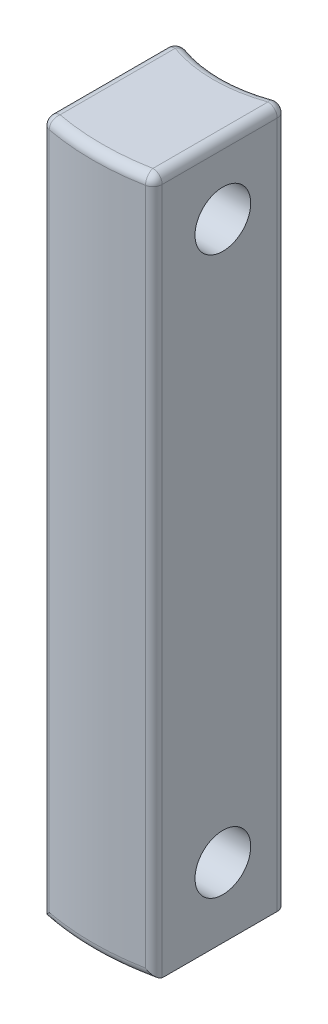
ISO-10303-21;
HEADER;
FILE_DESCRIPTION(('STEP AP214'),'2;1');
FILE_NAME('part.step','',(''),(''),'','','');
FILE_SCHEMA(('AUTOMOTIVE_DESIGN { 1 0 10303 214 1 1 1 1 }'));
ENDSEC;
DATA;
#1=APPLICATION_CONTEXT('core data for automotive mechanical design processes');
#2=APPLICATION_PROTOCOL_DEFINITION('international standard','automotive_design',2000,#1);
#3=PRODUCT_CONTEXT('',#1,'mechanical');
#4=PRODUCT('Part','Part','',(#3));
#5=PRODUCT_RELATED_PRODUCT_CATEGORY('part','',(#4));
#6=PRODUCT_DEFINITION_FORMATION('','',#4);
#7=PRODUCT_DEFINITION_CONTEXT('part definition',#1,'design');
#8=PRODUCT_DEFINITION('design','',#6,#7);
#9=PRODUCT_DEFINITION_SHAPE('','',#8);
#10=(LENGTH_UNIT() NAMED_UNIT(*) SI_UNIT(.MILLI.,.METRE.));
#11=(NAMED_UNIT(*) PLANE_ANGLE_UNIT() SI_UNIT($,.RADIAN.));
#12=(NAMED_UNIT(*) SI_UNIT($,.STERADIAN.) SOLID_ANGLE_UNIT());
#13=UNCERTAINTY_MEASURE_WITH_UNIT(LENGTH_MEASURE(1.E-05),#10,'distance_accuracy_value','');
#14=(GEOMETRIC_REPRESENTATION_CONTEXT(3) GLOBAL_UNCERTAINTY_ASSIGNED_CONTEXT((#13)) GLOBAL_UNIT_ASSIGNED_CONTEXT((#10,
#11,#12)) REPRESENTATION_CONTEXT('',''));
#15=CARTESIAN_POINT('',(0.,0.,0.));
#16=DIRECTION('',(0.,0.,1.));
#17=DIRECTION('',(1.,0.,0.));
#18=AXIS2_PLACEMENT_3D('',#15,#16,#17);
#19=CARTESIAN_POINT('',(0.,37.5,-19.9993496515141));
#20=DIRECTION('',(0.,-1.,0.));
#21=DIRECTION('',(0.,0.,-1.));
#22=AXIS2_PLACEMENT_3D('',#19,#20,#21);
#23=CYLINDRICAL_SURFACE('',#22,14.);
#24=DIRECTION('',(0.,-1.,0.));
#25=VECTOR('',#24,1.);
#26=CARTESIAN_POINT('',(4.66666666666667,37.5,-6.80002306936521));
#27=LINE('',#26,#25);
#28=CARTESIAN_POINT('',(4.66666666666667,36.5,-6.80002306936521));
#29=VERTEX_POINT('',#28);
#30=CARTESIAN_POINT('',(4.66666666666667,-36.5,-6.80002306936521));
#31=VERTEX_POINT('',#30);
#32=EDGE_CURVE('E145',#29,#31,#27,.T.);
#33=ORIENTED_EDGE('',*,*,#32,.T.);
#34=CARTESIAN_POINT('',(0.,-36.5,-19.9993496515141));
#35=DIRECTION('',(0.,1.,0.));
#36=DIRECTION('',(0.,0.,1.));
#37=AXIS2_PLACEMENT_3D('',#34,#35,#36);
#38=CIRCLE('',#37,14.);
#39=CARTESIAN_POINT('',(-4.66666666666667,-36.5,-6.80002306936521));
#40=VERTEX_POINT('',#39);
#41=EDGE_CURVE('E136',#31,#40,#38,.F.);
#42=ORIENTED_EDGE('',*,*,#41,.T.);
#43=DIRECTION('',(0.,-1.,0.));
#44=VECTOR('',#43,1.);
#45=CARTESIAN_POINT('',(-4.66666666666667,37.5,-6.80002306936521));
#46=LINE('',#45,#44);
#47=CARTESIAN_POINT('',(-4.66666666666667,36.5,-6.80002306936521));
#48=VERTEX_POINT('',#47);
#49=EDGE_CURVE('E132',#40,#48,#46,.F.);
#50=ORIENTED_EDGE('',*,*,#49,.T.);
#51=CARTESIAN_POINT('',(0.,36.5,-19.9993496515141));
#52=DIRECTION('',(0.,1.,0.));
#53=DIRECTION('',(0.,0.,1.));
#54=AXIS2_PLACEMENT_3D('',#51,#52,#53);
#55=CIRCLE('',#54,14.);
#56=EDGE_CURVE('E140',#48,#29,#55,.T.);
#57=ORIENTED_EDGE('',*,*,#56,.T.);
#58=EDGE_LOOP('',(#33,#42,#50,#57));
#59=FACE_BOUND('',#58,.T.);
#60=ADVANCED_FACE('F39',(#59),#23,.F.);
#61=CARTESIAN_POINT('',(-6.,37.5,-7.35023901084058));
#62=DIRECTION('',(1.,0.,0.));
#63=DIRECTION('',(0.,0.,-1.));
#64=AXIS2_PLACEMENT_3D('',#61,#62,#63);
#65=PLANE('',#64);
#66=DIRECTION('',(0.,0.,1.));
#67=VECTOR('',#66,1.);
#68=CARTESIAN_POINT('',(-6.,-37.5,-7.35023901084058));
#69=LINE('',#68,#67);
#70=CARTESIAN_POINT('',(-6.,-37.5,-5.85721402778315));
#71=VERTEX_POINT('',#70);
#72=CARTESIAN_POINT('',(-6.,-37.5,6.32554351066226));
#73=VERTEX_POINT('',#72);
#74=EDGE_CURVE('E175',#71,#73,#69,.T.);
#75=ORIENTED_EDGE('',*,*,#74,.T.);
#76=CARTESIAN_POINT('',(-6.,-37.5,6.32554351066226));
#77=CARTESIAN_POINT('',(-6.,-37.4999933589737,6.36057381598417));
#78=CARTESIAN_POINT('',(-6.,-37.4982559537451,6.39543105723422));
#79=CARTESIAN_POINT('',(-6.,-37.4913196115974,6.46479944445109));
#80=CARTESIAN_POINT('',(-6.,-37.4861206713989,6.49931059008999));
#81=CARTESIAN_POINT('',(-6.,-37.4791909637185,6.53364867132909));
#82=B_SPLINE_CURVE_WITH_KNOTS('',3,(#76,#77,#78,#79,#80,#81),.UNSPECIFIED.,.F.,.F.,(4,2,4),(0.,
0.104701540582892,0.209403180362209),.UNSPECIFIED.);
#83=CARTESIAN_POINT('',(-6.,-37.4791909637185,6.53364867132909));
#84=VERTEX_POINT('',#83);
#85=EDGE_CURVE('E226',#73,#84,#82,.T.);
#86=ORIENTED_EDGE('',*,*,#85,.T.);
#87=DIRECTION('',(0.,-1.,0.));
#88=VECTOR('',#87,1.);
#89=CARTESIAN_POINT('',(-6.,37.5,6.53364867132909));
#90=LINE('',#89,#88);
#91=CARTESIAN_POINT('',(-6.,36.5,6.5336486713291));
#92=VERTEX_POINT('',#91);
#93=EDGE_CURVE('E478',#84,#92,#90,.F.);
#94=ORIENTED_EDGE('',*,*,#93,.T.);
#95=DIRECTION('',(0.,0.,1.));
#96=VECTOR('',#95,1.);
#97=CARTESIAN_POINT('',(-6.,36.5,-7.35023901084058));
#98=LINE('',#97,#96);
#99=CARTESIAN_POINT('',(-6.,36.5,-5.85721402778315));
#100=VERTEX_POINT('',#99);
#101=EDGE_CURVE('E199',#92,#100,#98,.F.);
#102=ORIENTED_EDGE('',*,*,#101,.T.);
#103=DIRECTION('',(0.,-1.,0.));
#104=VECTOR('',#103,1.);
#105=CARTESIAN_POINT('',(-6.,37.5,-5.85721402778315));
#106=LINE('',#105,#104);
#107=EDGE_CURVE('E155',#100,#71,#106,.T.);
#108=ORIENTED_EDGE('',*,*,#107,.T.);
#109=EDGE_LOOP('',(#75,#86,#94,#102,#108));
#110=FACE_BOUND('',#109,.T.);
#111=CARTESIAN_POINT('',(-6.,30.,0.));
#112=DIRECTION('',(1.,0.,0.));
#113=DIRECTION('',(0.,0.,-1.));
#114=AXIS2_PLACEMENT_3D('',#111,#112,#113);
#115=CIRCLE('',#114,3.);
#116=CARTESIAN_POINT('',(-6.,30.,-3.));
#117=VERTEX_POINT('',#116);
#118=EDGE_CURVE('E494',#117,#117,#115,.T.);
#119=ORIENTED_EDGE('',*,*,#118,.T.);
#120=EDGE_LOOP('',(#119));
#121=FACE_BOUND('',#120,.T.);
#122=CARTESIAN_POINT('',(-6.,-30.,0.));
#123=DIRECTION('',(1.,0.,0.));
#124=DIRECTION('',(0.,0.,-1.));
#125=AXIS2_PLACEMENT_3D('',#122,#123,#124);
#126=CIRCLE('',#125,3.);
#127=CARTESIAN_POINT('',(-6.,-30.,-3.));
#128=VERTEX_POINT('',#127);
#129=EDGE_CURVE('E490',#128,#128,#126,.T.);
#130=ORIENTED_EDGE('',*,*,#129,.T.);
#131=EDGE_LOOP('',(#130));
#132=FACE_BOUND('',#131,.T.);
#133=ADVANCED_FACE('F217',(#110,#121,#132),#65,.F.);
#134=CARTESIAN_POINT('',(0.,37.5,-19.9993496515141));
#135=DIRECTION('',(0.,-1.,0.));
#136=DIRECTION('',(0.,0.,-1.));
#137=AXIS2_PLACEMENT_3D('',#134,#135,#136);
#138=CYLINDRICAL_SURFACE('',#137,28.);
#139=DIRECTION('',(0.,-1.,0.));
#140=VECTOR('',#139,1.);
#141=CARTESIAN_POINT('',(-5.18518518518518,37.5,7.51635231291588));
#142=LINE('',#141,#140);
#143=CARTESIAN_POINT('',(-5.18518518518518,36.5,7.51635231291588));
#144=VERTEX_POINT('',#143);
#145=CARTESIAN_POINT('',(-5.18518518518518,-36.5,7.51635231291588));
#146=VERTEX_POINT('',#145);
#147=EDGE_CURVE('E240',#144,#146,#142,.T.);
#148=ORIENTED_EDGE('',*,*,#147,.T.);
#149=CARTESIAN_POINT('',(0.,-36.5,-19.9993496515141));
#150=DIRECTION('',(0.,1.,0.));
#151=DIRECTION('',(0.,0.,1.));
#152=AXIS2_PLACEMENT_3D('',#149,#150,#151);
#153=CIRCLE('',#152,28.);
#154=CARTESIAN_POINT('',(5.18518518518518,-36.5,7.51635231291588));
#155=VERTEX_POINT('',#154);
#156=EDGE_CURVE('E238',#146,#155,#153,.T.);
#157=ORIENTED_EDGE('',*,*,#156,.T.);
#158=DIRECTION('',(0.,-1.,0.));
#159=VECTOR('',#158,1.);
#160=CARTESIAN_POINT('',(5.18518518518518,37.5,7.51635231291588));
#161=LINE('',#160,#159);
#162=CARTESIAN_POINT('',(5.18518518518518,36.5,7.51635231291588));
#163=VERTEX_POINT('',#162);
#164=EDGE_CURVE('E231',#155,#163,#161,.F.);
#165=ORIENTED_EDGE('',*,*,#164,.T.);
#166=CARTESIAN_POINT('',(0.,36.5,-19.9993496515141));
#167=DIRECTION('',(0.,1.,0.));
#168=DIRECTION('',(0.,0.,1.));
#169=AXIS2_PLACEMENT_3D('',#166,#167,#168);
#170=CIRCLE('',#169,28.);
#171=EDGE_CURVE('E233',#163,#144,#170,.F.);
#172=ORIENTED_EDGE('',*,*,#171,.T.);
#173=EDGE_LOOP('',(#148,#157,#165,#172));
#174=FACE_BOUND('',#173,.T.);
#175=ADVANCED_FACE('F215',(#174),#138,.T.);
#176=CARTESIAN_POINT('',(6.,37.5,-7.35023901084058));
#177=DIRECTION('',(-1.,0.,0.));
#178=DIRECTION('',(0.,0.,1.));
#179=AXIS2_PLACEMENT_3D('',#176,#177,#178);
#180=PLANE('',#179);
#181=CARTESIAN_POINT('',(6.,30.,0.));
#182=DIRECTION('',(1.,0.,0.));
#183=DIRECTION('',(0.,0.,-1.));
#184=AXIS2_PLACEMENT_3D('',#181,#182,#183);
#185=CIRCLE('',#184,3.);
#186=CARTESIAN_POINT('',(6.,30.,-3.));
#187=VERTEX_POINT('',#186);
#188=EDGE_CURVE('E495',#187,#187,#185,.T.);
#189=ORIENTED_EDGE('',*,*,#188,.F.);
#190=EDGE_LOOP('',(#189));
#191=FACE_BOUND('',#190,.T.);
#192=CARTESIAN_POINT('',(6.,-30.,0.));
#193=DIRECTION('',(1.,0.,0.));
#194=DIRECTION('',(0.,0.,-1.));
#195=AXIS2_PLACEMENT_3D('',#192,#193,#194);
#196=CIRCLE('',#195,3.);
#197=CARTESIAN_POINT('',(6.,-30.,-3.));
#198=VERTEX_POINT('',#197);
#199=EDGE_CURVE('E484',#198,#198,#196,.T.);
#200=ORIENTED_EDGE('',*,*,#199,.F.);
#201=EDGE_LOOP('',(#200));
#202=FACE_BOUND('',#201,.T.);
#203=DIRECTION('',(0.,-1.,0.));
#204=VECTOR('',#203,1.);
#205=CARTESIAN_POINT('',(6.,37.5,6.53364867132909));
#206=LINE('',#205,#204);
#207=CARTESIAN_POINT('',(6.,36.5,6.5336486713291));
#208=VERTEX_POINT('',#207);
#209=CARTESIAN_POINT('',(6.,-37.4791909637185,6.53364867132909));
#210=VERTEX_POINT('',#209);
#211=EDGE_CURVE('E187',#208,#210,#206,.T.);
#212=ORIENTED_EDGE('',*,*,#211,.T.);
#213=CARTESIAN_POINT('',(6.,-37.4791909637185,6.53364867132909));
#214=CARTESIAN_POINT('',(6.,-37.4861206713989,6.49931059008999));
#215=CARTESIAN_POINT('',(6.,-37.4913196115974,6.46479944445109));
#216=CARTESIAN_POINT('',(6.,-37.4982559537451,6.39543105723422));
#217=CARTESIAN_POINT('',(6.,-37.4999933589737,6.36057381598417));
#218=CARTESIAN_POINT('',(6.,-37.5,6.32554351066226));
#219=B_SPLINE_CURVE_WITH_KNOTS('',3,(#213,#214,#215,#216,#217,#218),.UNSPECIFIED.,.F.,.F.,(4,2,
4),(0.,0.104701639779317,0.209403180362209),.UNSPECIFIED.);
#220=CARTESIAN_POINT('',(6.,-37.5,6.32554351066226));
#221=VERTEX_POINT('',#220);
#222=EDGE_CURVE('E193',#210,#221,#219,.T.);
#223=ORIENTED_EDGE('',*,*,#222,.T.);
#224=DIRECTION('',(0.,0.,-1.));
#225=VECTOR('',#224,1.);
#226=CARTESIAN_POINT('',(6.,-37.5,-7.35023901084058));
#227=LINE('',#226,#225);
#228=CARTESIAN_POINT('',(6.,-37.5,-5.85721402778315));
#229=VERTEX_POINT('',#228);
#230=EDGE_CURVE('E166',#221,#229,#227,.T.);
#231=ORIENTED_EDGE('',*,*,#230,.T.);
#232=DIRECTION('',(0.,-1.,0.));
#233=VECTOR('',#232,1.);
#234=CARTESIAN_POINT('',(6.,37.5,-5.85721402778315));
#235=LINE('',#234,#233);
#236=CARTESIAN_POINT('',(6.,36.5,-5.85721402778315));
#237=VERTEX_POINT('',#236);
#238=EDGE_CURVE('E189',#229,#237,#235,.F.);
#239=ORIENTED_EDGE('',*,*,#238,.T.);
#240=DIRECTION('',(0.,0.,-1.));
#241=VECTOR('',#240,1.);
#242=CARTESIAN_POINT('',(6.,36.5,7.35023901084058));
#243=LINE('',#242,#241);
#244=EDGE_CURVE('E186',#237,#208,#243,.F.);
#245=ORIENTED_EDGE('',*,*,#244,.T.);
#246=EDGE_LOOP('',(#212,#223,#231,#239,#245));
#247=FACE_BOUND('',#246,.T.);
#248=ADVANCED_FACE('F206',(#191,#202,#247),#180,.F.);
#249=CARTESIAN_POINT('',(0.,37.5,-19.9993496515141));
#250=DIRECTION('',(0.,1.,0.));
#251=DIRECTION('',(0.,0.,1.));
#252=AXIS2_PLACEMENT_3D('',#249,#250,#251);
#253=PLANE('',#252);
#254=CARTESIAN_POINT('',(0.,37.5,-19.9993496515141));
#255=DIRECTION('',(0.,1.,0.));
#256=DIRECTION('',(0.,0.,1.));
#257=AXIS2_PLACEMENT_3D('',#254,#255,#256);
#258=CIRCLE('',#257,27.);
#259=CARTESIAN_POINT('',(-5.,37.5,6.5336486713291));
#260=VERTEX_POINT('',#259);
#261=CARTESIAN_POINT('',(5.,37.5,6.5336486713291));
#262=VERTEX_POINT('',#261);
#263=EDGE_CURVE('E53',#260,#262,#258,.T.);
#264=ORIENTED_EDGE('',*,*,#263,.T.);
#265=DIRECTION('',(0.,0.,-1.));
#266=VECTOR('',#265,1.);
#267=CARTESIAN_POINT('',(5.,37.5,-7.35023901084058));
#268=LINE('',#267,#266);
#269=CARTESIAN_POINT('',(5.,37.5,-5.85721402778315));
#270=VERTEX_POINT('',#269);
#271=EDGE_CURVE('E11',#262,#270,#268,.T.);
#272=ORIENTED_EDGE('',*,*,#271,.T.);
#273=CARTESIAN_POINT('',(0.,37.5,-19.9993496515141));
#274=DIRECTION('',(0.,1.,0.));
#275=DIRECTION('',(0.,0.,1.));
#276=AXIS2_PLACEMENT_3D('',#273,#274,#275);
#277=CIRCLE('',#276,15.);
#278=CARTESIAN_POINT('',(-5.,37.5,-5.85721402778315));
#279=VERTEX_POINT('',#278);
#280=EDGE_CURVE('E245',#270,#279,#277,.F.);
#281=ORIENTED_EDGE('',*,*,#280,.T.);
#282=DIRECTION('',(0.,0.,1.));
#283=VECTOR('',#282,1.);
#284=CARTESIAN_POINT('',(-5.,37.5,7.35023901084058));
#285=LINE('',#284,#283);
#286=EDGE_CURVE('E64',#279,#260,#285,.T.);
#287=ORIENTED_EDGE('',*,*,#286,.T.);
#288=EDGE_LOOP('',(#264,#272,#281,#287));
#289=FACE_BOUND('',#288,.T.);
#290=ADVANCED_FACE('F211',(#289),#253,.T.);
#291=CARTESIAN_POINT('',(0.,-37.5,-19.9993496515141));
#292=DIRECTION('',(0.,1.,0.));
#293=DIRECTION('',(0.,0.,1.));
#294=AXIS2_PLACEMENT_3D('',#291,#292,#293);
#295=PLANE('',#294);
#296=CARTESIAN_POINT('',(0.,-37.5,-19.9993496515141));
#297=DIRECTION('',(0.,1.,0.));
#298=DIRECTION('',(0.,0.,1.));
#299=AXIS2_PLACEMENT_3D('',#296,#297,#298);
#300=CIRCLE('',#299,15.);
#301=CARTESIAN_POINT('',(-5.93117400209396,-37.5,-6.22178909251511));
#302=VERTEX_POINT('',#301);
#303=CARTESIAN_POINT('',(5.93117400209396,-37.5,-6.22178909251511));
#304=VERTEX_POINT('',#303);
#305=EDGE_CURVE('E176',#302,#304,#300,.T.);
#306=ORIENTED_EDGE('',*,*,#305,.T.);
#307=CARTESIAN_POINT('',(5.,-37.5,-5.85721402778315));
#308=DIRECTION('',(0.,1.,0.));
#309=DIRECTION('',(0.,0.,1.));
#310=AXIS2_PLACEMENT_3D('',#307,#308,#309);
#311=CIRCLE('',#310,1.);
#312=EDGE_CURVE('E184',#304,#229,#311,.F.);
#313=ORIENTED_EDGE('',*,*,#312,.T.);
#314=ORIENTED_EDGE('',*,*,#230,.F.);
#315=CARTESIAN_POINT('',(0.,-37.5,-19.9993496515141));
#316=DIRECTION('',(0.,1.,0.));
#317=DIRECTION('',(0.,0.,1.));
#318=AXIS2_PLACEMENT_3D('',#315,#316,#317);
#319=CIRCLE('',#318,27.);
#320=EDGE_CURVE('E178',#221,#73,#319,.F.);
#321=ORIENTED_EDGE('',*,*,#320,.T.);
#322=ORIENTED_EDGE('',*,*,#74,.F.);
#323=CARTESIAN_POINT('',(-5.,-37.5,-5.85721402778315));
#324=DIRECTION('',(0.,1.,0.));
#325=DIRECTION('',(0.,0.,1.));
#326=AXIS2_PLACEMENT_3D('',#323,#324,#325);
#327=CIRCLE('',#326,1.);
#328=EDGE_CURVE('E185',#71,#302,#327,.F.);
#329=ORIENTED_EDGE('',*,*,#328,.T.);
#330=EDGE_LOOP('',(#306,#313,#314,#321,#322,#329));
#331=FACE_BOUND('',#330,.T.);
#332=ADVANCED_FACE('F212',(#331),#295,.F.);
#333=CARTESIAN_POINT('',(-6.,-30.,0.));
#334=DIRECTION('',(1.,0.,0.));
#335=DIRECTION('',(0.,0.,-1.));
#336=AXIS2_PLACEMENT_3D('',#333,#334,#335);
#337=CYLINDRICAL_SURFACE('',#336,3.);
#338=ORIENTED_EDGE('',*,*,#129,.F.);
#339=EDGE_LOOP('',(#338));
#340=FACE_BOUND('',#339,.T.);
#341=ORIENTED_EDGE('',*,*,#199,.T.);
#342=EDGE_LOOP('',(#341));
#343=FACE_BOUND('',#342,.T.);
#344=ADVANCED_FACE('F341',(#340,#343),#337,.F.);
#345=CARTESIAN_POINT('',(-6.,30.,0.));
#346=DIRECTION('',(1.,0.,0.));
#347=DIRECTION('',(0.,0.,-1.));
#348=AXIS2_PLACEMENT_3D('',#345,#346,#347);
#349=CYLINDRICAL_SURFACE('',#348,3.);
#350=ORIENTED_EDGE('',*,*,#118,.F.);
#351=EDGE_LOOP('',(#350));
#352=FACE_BOUND('',#351,.T.);
#353=ORIENTED_EDGE('',*,*,#188,.T.);
#354=EDGE_LOOP('',(#353));
#355=FACE_BOUND('',#354,.T.);
#356=ADVANCED_FACE('F320',(#352,#355),#349,.F.);
#357=CARTESIAN_POINT('',(-5.,37.5,6.5336486713291));
#358=DIRECTION('',(0.,-1.,0.));
#359=DIRECTION('',(0.,0.,-1.));
#360=AXIS2_PLACEMENT_3D('',#357,#358,#359);
#361=CYLINDRICAL_SURFACE('',#360,1.);
#362=CARTESIAN_POINT('',(-5.,36.5,6.5336486713291));
#363=DIRECTION('',(0.,1.,0.));
#364=DIRECTION('',(0.,0.,1.));
#365=AXIS2_PLACEMENT_3D('',#362,#363,#364);
#366=CIRCLE('',#365,1.);
#367=EDGE_CURVE('E293',#92,#144,#366,.T.);
#368=ORIENTED_EDGE('',*,*,#367,.F.);
#369=ORIENTED_EDGE('',*,*,#93,.F.);
#370=CARTESIAN_POINT('',(-6.,-37.4791909637185,6.5336486713291));
#371=CARTESIAN_POINT('',(-6.00003940653641,-37.4688526298121,6.58495804073304));
#372=CARTESIAN_POINT('',(-5.99605917155711,-37.4548387941824,6.63524390238593));
#373=CARTESIAN_POINT('',(-5.98128794305442,-37.4209916165056,6.73221865595665));
#374=CARTESIAN_POINT('',(-5.970567039503,-37.4012192740386,6.77893908207847));
#375=CARTESIAN_POINT('',(-5.94357856516702,-37.3572533548157,6.86805346302905));
#376=CARTESIAN_POINT('',(-5.92734510972422,-37.3330873862105,6.9104719926003));
#377=CARTESIAN_POINT('',(-5.8903314527297,-37.2812768724568,6.99112261138698));
#378=CARTESIAN_POINT('',(-5.86953769789048,-37.2536220647574,7.0293417004655));
#379=CARTESIAN_POINT('',(-5.81130238077109,-37.1791024964275,7.12210363850815));
#380=CARTESIAN_POINT('',(-5.77115709401002,-37.1303246818911,7.1734199581676));
#381=CARTESIAN_POINT('',(-5.68438159945463,-37.0287339972445,7.2655213451939));
#382=CARTESIAN_POINT('',(-5.63773680237307,-36.9759121732974,7.3062821134306));
#383=CARTESIAN_POINT('',(-5.52780660348593,-36.8546301324981,7.38635472187438));
#384=CARTESIAN_POINT('',(-5.46323904099648,-36.7855007724865,7.42288245234499));
#385=CARTESIAN_POINT('',(-5.32945195880395,-36.6457169286107,7.48061777651952));
#386=CARTESIAN_POINT('',(-5.26024383509941,-36.5750664506437,7.50186149879649));
#387=CARTESIAN_POINT('',(-5.18819510660892,-36.5030083590571,7.51578152142685));
#388=CARTESIAN_POINT('',(-5.1866904445492,-36.5015041530185,7.51606864789567));
#389=CARTESIAN_POINT('',(-5.18518518518518,-36.5,7.51635231291588));
#390=B_SPLINE_CURVE_WITH_KNOTS('',3,(#370,#371,#372,#373,#374,#375,#376,#377,#378,#379,#380,
#381,#382,#383,#384,#385,#386,#387,#388,#389),.UNSPECIFIED.,.F.,.F.,(4,2,2,2,2,2,2,2,2,4),(0.,
0.156332039672823,0.311064816893903,0.464856947156842,0.619112498446091,0.861933657717006,
1.10530892543237,1.40811151639619,1.7101959650137,1.71663658555628),.UNSPECIFIED.);
#391=EDGE_CURVE('E42',#146,#84,#390,.F.);
#392=ORIENTED_EDGE('',*,*,#391,.F.);
#393=ORIENTED_EDGE('',*,*,#147,.F.);
#394=EDGE_LOOP('',(#368,#369,#392,#393));
#395=FACE_BOUND('',#394,.T.);
#396=ADVANCED_FACE('F41',(#395),#361,.T.);
#397=CARTESIAN_POINT('',(0.,-36.5,-19.9993496515141));
#398=DIRECTION('',(0.,1.,0.));
#399=DIRECTION('',(0.,0.,1.));
#400=AXIS2_PLACEMENT_3D('',#397,#398,#399);
#401=TOROIDAL_SURFACE('',#400,27.,1.);
#402=ORIENTED_EDGE('',*,*,#320,.F.);
#403=ORIENTED_EDGE('',*,*,#222,.F.);
#404=CARTESIAN_POINT('',(6.,-37.4791909637185,6.5336486713291));
#405=CARTESIAN_POINT('',(6.00003940653641,-37.4688526298121,6.58495804073304));
#406=CARTESIAN_POINT('',(5.99605917155711,-37.4548387941824,6.63524390238594));
#407=CARTESIAN_POINT('',(5.98128794305442,-37.4209916165056,6.73221865595665));
#408=CARTESIAN_POINT('',(5.97056703950299,-37.4012192740386,6.77893908207847));
#409=CARTESIAN_POINT('',(5.94357856516702,-37.3572533548157,6.86805346302905));
#410=CARTESIAN_POINT('',(5.92734510972422,-37.3330873862105,6.91047199260031));
#411=CARTESIAN_POINT('',(5.8903314527297,-37.2812768724568,6.99112261138698));
#412=CARTESIAN_POINT('',(5.86953769789047,-37.2536220647574,7.02934170046551));
#413=CARTESIAN_POINT('',(5.8113023807711,-37.1791024964275,7.12210363850815));
#414=CARTESIAN_POINT('',(5.77115709401008,-37.1303246818911,7.1734199581676));
#415=CARTESIAN_POINT('',(5.68438159945457,-37.0287339972446,7.26552134519391));
#416=CARTESIAN_POINT('',(5.63773680237285,-36.9759121732976,7.30628211343065));
#417=CARTESIAN_POINT('',(5.52780660348621,-36.8546301324979,7.38635472187433));
#418=CARTESIAN_POINT('',(5.46323904099764,-36.7855007724853,7.42288245234477));
#419=CARTESIAN_POINT('',(5.3294519588028,-36.6457169286119,7.48061777651974));
#420=CARTESIAN_POINT('',(5.26024383509507,-36.5750664506482,7.50186149879732));
#421=CARTESIAN_POINT('',(5.18819510660873,-36.5030083590573,7.51578152142689));
#422=CARTESIAN_POINT('',(5.18669044454911,-36.5015041530186,7.51606864789569));
#423=CARTESIAN_POINT('',(5.18518518518518,-36.5,7.51635231291588));
#424=B_SPLINE_CURVE_WITH_KNOTS('',3,(#404,#405,#406,#407,#408,#409,#410,#411,#412,#413,#414,
#415,#416,#417,#418,#419,#420,#421,#422,#423),.UNSPECIFIED.,.F.,.F.,(4,2,2,2,2,2,2,2,2,4),(0.,
0.156332039672828,0.311064816893903,0.464856947156845,0.619112498446091,0.861933657717008,
1.10530892543237,1.40811151639619,1.7101959650137,1.71663658555628),.UNSPECIFIED.);
#425=EDGE_CURVE('E289',#155,#210,#424,.F.);
#426=ORIENTED_EDGE('',*,*,#425,.F.);
#427=ORIENTED_EDGE('',*,*,#156,.F.);
#428=ORIENTED_EDGE('',*,*,#391,.T.);
#429=ORIENTED_EDGE('',*,*,#85,.F.);
#430=EDGE_LOOP('',(#402,#403,#426,#427,#428,#429));
#431=FACE_BOUND('',#430,.T.);
#432=ADVANCED_FACE('F205',(#431),#401,.T.);
#433=CARTESIAN_POINT('',(-5.,36.5,6.5336486713291));
#434=DIRECTION('',(0.,1.,0.));
#435=DIRECTION('',(0.,0.,1.));
#436=AXIS2_PLACEMENT_3D('',#433,#434,#435);
#437=SPHERICAL_SURFACE('',#436,1.);
#438=CARTESIAN_POINT('',(-5.,36.5,6.5336486713291));
#439=DIRECTION('',(0.,0.,1.));
#440=DIRECTION('',(1.,0.,0.));
#441=AXIS2_PLACEMENT_3D('',#438,#439,#440);
#442=CIRCLE('',#441,1.);
#443=EDGE_CURVE('E283',#92,#260,#442,.F.);
#444=ORIENTED_EDGE('',*,*,#443,.F.);
#445=ORIENTED_EDGE('',*,*,#367,.T.);
#446=CARTESIAN_POINT('',(-5.,36.5,6.5336486713291));
#447=DIRECTION('',(-0.982703641586785,0.,-0.185185185185185));
#448=DIRECTION('',(-0.185185185185185,0.,0.982703641586785));
#449=AXIS2_PLACEMENT_3D('',#446,#447,#448);
#450=CIRCLE('',#449,1.);
#451=EDGE_CURVE('E287',#260,#144,#450,.F.);
#452=ORIENTED_EDGE('',*,*,#451,.F.);
#453=EDGE_LOOP('',(#444,#445,#452));
#454=FACE_BOUND('',#453,.T.);
#455=ADVANCED_FACE('F299',(#454),#437,.T.);
#456=CARTESIAN_POINT('',(5.,37.5,6.5336486713291));
#457=DIRECTION('',(0.,-1.,0.));
#458=DIRECTION('',(0.,0.,-1.));
#459=AXIS2_PLACEMENT_3D('',#456,#457,#458);
#460=CYLINDRICAL_SURFACE('',#459,1.);
#461=ORIENTED_EDGE('',*,*,#425,.T.);
#462=ORIENTED_EDGE('',*,*,#211,.F.);
#463=CARTESIAN_POINT('',(5.,36.5,6.5336486713291));
#464=DIRECTION('',(0.,1.,0.));
#465=DIRECTION('',(0.,0.,1.));
#466=AXIS2_PLACEMENT_3D('',#463,#464,#465);
#467=CIRCLE('',#466,1.);
#468=EDGE_CURVE('E281',#163,#208,#467,.T.);
#469=ORIENTED_EDGE('',*,*,#468,.F.);
#470=ORIENTED_EDGE('',*,*,#164,.F.);
#471=EDGE_LOOP('',(#461,#462,#469,#470));
#472=FACE_BOUND('',#471,.T.);
#473=ADVANCED_FACE('F296',(#472),#460,.T.);
#474=CARTESIAN_POINT('',(0.,36.5,-19.9993496515141));
#475=DIRECTION('',(0.,1.,0.));
#476=DIRECTION('',(0.,0.,1.));
#477=AXIS2_PLACEMENT_3D('',#474,#475,#476);
#478=TOROIDAL_SURFACE('',#477,27.,1.);
#479=ORIENTED_EDGE('',*,*,#451,.T.);
#480=ORIENTED_EDGE('',*,*,#171,.F.);
#481=CARTESIAN_POINT('',(5.,36.5,6.5336486713291));
#482=DIRECTION('',(0.982703641586785,0.,-0.185185185185185));
#483=DIRECTION('',(-0.185185185185185,0.,-0.982703641586785));
#484=AXIS2_PLACEMENT_3D('',#481,#482,#483);
#485=CIRCLE('',#484,1.);
#486=EDGE_CURVE('E279',#262,#163,#485,.T.);
#487=ORIENTED_EDGE('',*,*,#486,.F.);
#488=ORIENTED_EDGE('',*,*,#263,.F.);
#489=EDGE_LOOP('',(#479,#480,#487,#488));
#490=FACE_BOUND('',#489,.T.);
#491=ADVANCED_FACE('F298',(#490),#478,.T.);
#492=CARTESIAN_POINT('',(-5.,36.5,-19.9993496515141));
#493=DIRECTION('',(0.,0.,-1.));
#494=DIRECTION('',(-1.,0.,0.));
#495=AXIS2_PLACEMENT_3D('',#492,#493,#494);
#496=CYLINDRICAL_SURFACE('',#495,1.);
#497=ORIENTED_EDGE('',*,*,#443,.T.);
#498=ORIENTED_EDGE('',*,*,#286,.F.);
#499=CARTESIAN_POINT('',(-5.,36.5,-5.85721402778315));
#500=DIRECTION('',(0.,0.,-1.));
#501=DIRECTION('',(0.,1.,0.));
#502=AXIS2_PLACEMENT_3D('',#499,#500,#501);
#503=CIRCLE('',#502,1.);
#504=EDGE_CURVE('E161',#100,#279,#503,.T.);
#505=ORIENTED_EDGE('',*,*,#504,.F.);
#506=ORIENTED_EDGE('',*,*,#101,.F.);
#507=EDGE_LOOP('',(#497,#498,#505,#506));
#508=FACE_BOUND('',#507,.T.);
#509=ADVANCED_FACE('F377',(#508),#496,.T.);
#510=CARTESIAN_POINT('',(5.,36.5,6.5336486713291));
#511=DIRECTION('',(0.,1.,0.));
#512=DIRECTION('',(0.,0.,1.));
#513=AXIS2_PLACEMENT_3D('',#510,#511,#512);
#514=SPHERICAL_SURFACE('',#513,1.);
#515=ORIENTED_EDGE('',*,*,#486,.T.);
#516=ORIENTED_EDGE('',*,*,#468,.T.);
#517=CARTESIAN_POINT('',(5.,36.5,6.5336486713291));
#518=DIRECTION('',(0.,0.,1.));
#519=DIRECTION('',(0.,-1.,0.));
#520=AXIS2_PLACEMENT_3D('',#517,#518,#519);
#521=CIRCLE('',#520,1.);
#522=EDGE_CURVE('E163',#262,#208,#521,.F.);
#523=ORIENTED_EDGE('',*,*,#522,.F.);
#524=EDGE_LOOP('',(#515,#516,#523));
#525=FACE_BOUND('',#524,.T.);
#526=ADVANCED_FACE('F389',(#525),#514,.T.);
#527=CARTESIAN_POINT('',(-5.,36.5,-5.85721402778315));
#528=DIRECTION('',(0.,1.,0.));
#529=DIRECTION('',(0.,0.,1.));
#530=AXIS2_PLACEMENT_3D('',#527,#528,#529);
#531=SPHERICAL_SURFACE('',#530,1.);
#532=CARTESIAN_POINT('',(-5.,36.5,-5.85721402778315));
#533=DIRECTION('',(0.,1.,0.));
#534=DIRECTION('',(0.,0.,1.));
#535=AXIS2_PLACEMENT_3D('',#532,#533,#534);
#536=CIRCLE('',#535,1.);
#537=EDGE_CURVE('E146',#100,#48,#536,.F.);
#538=ORIENTED_EDGE('',*,*,#537,.F.);
#539=ORIENTED_EDGE('',*,*,#504,.T.);
#540=CARTESIAN_POINT('',(-5.,36.5,-5.85721402778315));
#541=DIRECTION('',(-0.942809041582063,0.,-0.333333333333334));
#542=DIRECTION('',(-0.333333333333334,0.,0.942809041582063));
#543=AXIS2_PLACEMENT_3D('',#540,#541,#542);
#544=CIRCLE('',#543,1.);
#545=EDGE_CURVE('E154',#48,#279,#544,.F.);
#546=ORIENTED_EDGE('',*,*,#545,.F.);
#547=EDGE_LOOP('',(#538,#539,#546));
#548=FACE_BOUND('',#547,.T.);
#549=ADVANCED_FACE('F157',(#548),#531,.T.);
#550=CARTESIAN_POINT('',(5.,36.5,-19.9993496515141));
#551=DIRECTION('',(0.,0.,1.));
#552=DIRECTION('',(1.,0.,0.));
#553=AXIS2_PLACEMENT_3D('',#550,#551,#552);
#554=CYLINDRICAL_SURFACE('',#553,1.);
#555=ORIENTED_EDGE('',*,*,#522,.T.);
#556=ORIENTED_EDGE('',*,*,#244,.F.);
#557=CARTESIAN_POINT('',(5.,36.5,-5.85721402778315));
#558=DIRECTION('',(0.,0.,-1.));
#559=DIRECTION('',(-1.,0.,0.));
#560=AXIS2_PLACEMENT_3D('',#557,#558,#559);
#561=CIRCLE('',#560,1.);
#562=EDGE_CURVE('E156',#270,#237,#561,.T.);
#563=ORIENTED_EDGE('',*,*,#562,.F.);
#564=ORIENTED_EDGE('',*,*,#271,.F.);
#565=EDGE_LOOP('',(#555,#556,#563,#564));
#566=FACE_BOUND('',#565,.T.);
#567=ADVANCED_FACE('F410',(#566),#554,.T.);
#568=CARTESIAN_POINT('',(0.,36.5,-19.9993496515141));
#569=DIRECTION('',(0.,1.,0.));
#570=DIRECTION('',(0.,0.,1.));
#571=AXIS2_PLACEMENT_3D('',#568,#569,#570);
#572=TOROIDAL_SURFACE('',#571,15.,1.);
#573=ORIENTED_EDGE('',*,*,#545,.T.);
#574=ORIENTED_EDGE('',*,*,#280,.F.);
#575=CARTESIAN_POINT('',(5.,36.5,-5.85721402778315));
#576=DIRECTION('',(0.942809041582063,0.,-0.333333333333333));
#577=DIRECTION('',(-0.333333333333333,0.,-0.942809041582063));
#578=AXIS2_PLACEMENT_3D('',#575,#576,#577);
#579=CIRCLE('',#578,1.);
#580=EDGE_CURVE('E170',#29,#270,#579,.T.);
#581=ORIENTED_EDGE('',*,*,#580,.F.);
#582=ORIENTED_EDGE('',*,*,#56,.F.);
#583=EDGE_LOOP('',(#573,#574,#581,#582));
#584=FACE_BOUND('',#583,.T.);
#585=ADVANCED_FACE('F167',(#584),#572,.T.);
#586=CARTESIAN_POINT('',(-5.,37.5,-5.85721402778315));
#587=DIRECTION('',(0.,-1.,0.));
#588=DIRECTION('',(0.,0.,-1.));
#589=AXIS2_PLACEMENT_3D('',#586,#587,#588);
#590=CYLINDRICAL_SURFACE('',#589,1.);
#591=ORIENTED_EDGE('',*,*,#537,.T.);
#592=ORIENTED_EDGE('',*,*,#49,.F.);
#593=CARTESIAN_POINT('',(-5.93117400209396,-37.5,-6.22178909251511));
#594=CARTESIAN_POINT('',(-5.92305985303531,-37.5000029439403,-6.24252181079715));
#595=CARTESIAN_POINT('',(-5.91425199718252,-37.4992566011987,-6.26296887975402));
#596=CARTESIAN_POINT('',(-5.89534880758742,-37.4962899815423,-6.30313101916534));
#597=CARTESIAN_POINT('',(-5.88525439532653,-37.4940707548236,-6.32284660061674));
#598=CARTESIAN_POINT('',(-5.85337125429151,-37.4852938582455,-6.38034011137851));
#599=CARTESIAN_POINT('',(-5.82982793653875,-37.4766158791519,-6.41685590156282));
#600=CARTESIAN_POINT('',(-5.77921671024263,-37.4542164426661,-6.48541696863274));
#601=CARTESIAN_POINT('',(-5.75215753149328,-37.4405073285279,-6.51747292393382));
#602=CARTESIAN_POINT('',(-5.6954674844937,-37.4088374589041,-6.57694854716806));
#603=CARTESIAN_POINT('',(-5.66583115963313,-37.3908675359963,-6.60435799667081));
#604=CARTESIAN_POINT('',(-5.5925137973543,-37.3434921434876,-6.66468457822117));
#605=CARTESIAN_POINT('',(-5.5480270375196,-37.3124095015051,-6.69530090887088));
#606=CARTESIAN_POINT('',(-5.45761540253006,-37.2454290530868,-6.74790802464018));
#607=CARTESIAN_POINT('',(-5.41168775289346,-37.2095214565197,-6.76988090599406));
#608=CARTESIAN_POINT('',(-5.30037791101076,-37.1187055063166,-6.81360804843196));
#609=CARTESIAN_POINT('',(-5.23485272301745,-37.0621080447671,-6.83146681411506));
#610=CARTESIAN_POINT('',(-5.10513969336518,-36.9449824417688,-6.85385067834451));
#611=CARTESIAN_POINT('',(-5.04095345569495,-36.8844499075864,-6.85836060496885));
#612=CARTESIAN_POINT('',(-4.92470017829015,-36.7707560350514,-6.85579632996352));
#613=CARTESIAN_POINT('',(-4.87228752047445,-36.7178929069399,-6.85039712097585));
#614=CARTESIAN_POINT('',(-4.76973512018026,-36.6115234215598,-6.83173320536495));
#615=CARTESIAN_POINT('',(-4.71959113491191,-36.5580185236688,-6.81848389475842));
#616=CARTESIAN_POINT('',(-4.66942973670592,-36.5030323604429,-6.80099654267479));
#617=CARTESIAN_POINT('',(-4.6680476493439,-36.5015161615233,-6.8005113141039));
#618=CARTESIAN_POINT('',(-4.66666666666667,-36.5,-6.80002306936521));
#619=B_SPLINE_CURVE_WITH_KNOTS('',3,(#593,#594,#595,#596,#597,#598,#599,#600,#601,#602,#603,
#604,#605,#606,#607,#608,#609,#610,#611,#612,#613,#614,#615,#616,#617,#618),.UNSPECIFIED.,.F.,
.F.,(4,2,2,2,2,2,2,2,2,2,2,2,4),(0.,0.0667418469081661,0.133436156573456,0.265582790138542,
0.397407362633289,0.529518180465141,0.715414453220723,0.901693783144152,1.16548555479732,
1.4295770299872,1.65305036852955,1.87608686393333,1.88241142662363),.UNSPECIFIED.);
#620=EDGE_CURVE('E266',#302,#40,#619,.T.);
#621=ORIENTED_EDGE('',*,*,#620,.F.);
#622=ORIENTED_EDGE('',*,*,#328,.F.);
#623=ORIENTED_EDGE('',*,*,#107,.F.);
#624=EDGE_LOOP('',(#591,#592,#621,#622,#623));
#625=FACE_BOUND('',#624,.T.);
#626=ADVANCED_FACE('F147',(#625),#590,.T.);
#627=CARTESIAN_POINT('',(5.,36.5,-5.85721402778315));
#628=DIRECTION('',(0.,1.,0.));
#629=DIRECTION('',(0.,0.,1.));
#630=AXIS2_PLACEMENT_3D('',#627,#628,#629);
#631=SPHERICAL_SURFACE('',#630,1.);
#632=ORIENTED_EDGE('',*,*,#580,.T.);
#633=ORIENTED_EDGE('',*,*,#562,.T.);
#634=CARTESIAN_POINT('',(5.,36.5,-5.85721402778315));
#635=DIRECTION('',(0.,1.,0.));
#636=DIRECTION('',(0.,0.,1.));
#637=AXIS2_PLACEMENT_3D('',#634,#635,#636);
#638=CIRCLE('',#637,1.);
#639=EDGE_CURVE('E251',#29,#237,#638,.F.);
#640=ORIENTED_EDGE('',*,*,#639,.F.);
#641=EDGE_LOOP('',(#632,#633,#640));
#642=FACE_BOUND('',#641,.T.);
#643=ADVANCED_FACE('F261',(#642),#631,.T.);
#644=CARTESIAN_POINT('',(0.,-36.5,-19.9993496515141));
#645=DIRECTION('',(0.,1.,0.));
#646=DIRECTION('',(0.,0.,1.));
#647=AXIS2_PLACEMENT_3D('',#644,#645,#646);
#648=TOROIDAL_SURFACE('',#647,15.,1.);
#649=ORIENTED_EDGE('',*,*,#620,.T.);
#650=ORIENTED_EDGE('',*,*,#41,.F.);
#651=CARTESIAN_POINT('',(5.93117400209396,-37.5,-6.22178909251511));
#652=CARTESIAN_POINT('',(5.92305985303531,-37.5000029439403,-6.24252181079715));
#653=CARTESIAN_POINT('',(5.91425199718252,-37.4992566011987,-6.26296887975402));
#654=CARTESIAN_POINT('',(5.89534880758742,-37.4962899815423,-6.30313101916534));
#655=CARTESIAN_POINT('',(5.88525439532653,-37.4940707548236,-6.32284660061674));
#656=CARTESIAN_POINT('',(5.85337125429151,-37.4852938582455,-6.38034011137851));
#657=CARTESIAN_POINT('',(5.82982793653875,-37.4766158791519,-6.41685590156282));
#658=CARTESIAN_POINT('',(5.77921671024263,-37.4542164426661,-6.48541696863274));
#659=CARTESIAN_POINT('',(5.75215753149328,-37.4405073285279,-6.51747292393382));
#660=CARTESIAN_POINT('',(5.6954674844937,-37.4088374589041,-6.57694854716806));
#661=CARTESIAN_POINT('',(5.66583115963313,-37.3908675359963,-6.60435799667081));
#662=CARTESIAN_POINT('',(5.5925137973543,-37.3434921434876,-6.66468457822117));
#663=CARTESIAN_POINT('',(5.5480270375196,-37.3124095015051,-6.69530090887088));
#664=CARTESIAN_POINT('',(5.45761540253006,-37.2454290530868,-6.74790802464018));
#665=CARTESIAN_POINT('',(5.41168775289346,-37.2095214565197,-6.76988090599406));
#666=CARTESIAN_POINT('',(5.30037791101076,-37.1187055063166,-6.81360804843196));
#667=CARTESIAN_POINT('',(5.23485272301745,-37.0621080447671,-6.83146681411506));
#668=CARTESIAN_POINT('',(5.10513969336518,-36.9449824417688,-6.85385067834451));
#669=CARTESIAN_POINT('',(5.04095345569495,-36.8844499075864,-6.85836060496885));
#670=CARTESIAN_POINT('',(4.92470017829015,-36.7707560350514,-6.85579632996352));
#671=CARTESIAN_POINT('',(4.87228752047445,-36.7178929069399,-6.85039712097585));
#672=CARTESIAN_POINT('',(4.76973512018026,-36.6115234215598,-6.83173320536495));
#673=CARTESIAN_POINT('',(4.71959113491191,-36.5580185236688,-6.81848389475842));
#674=CARTESIAN_POINT('',(4.66942973670592,-36.5030323604429,-6.80099654267479));
#675=CARTESIAN_POINT('',(4.6680476493439,-36.5015161615233,-6.8005113141039));
#676=CARTESIAN_POINT('',(4.66666666666667,-36.5,-6.80002306936521));
#677=B_SPLINE_CURVE_WITH_KNOTS('',3,(#651,#652,#653,#654,#655,#656,#657,#658,#659,#660,#661,
#662,#663,#664,#665,#666,#667,#668,#669,#670,#671,#672,#673,#674,#675,#676),.UNSPECIFIED.,.F.,
.F.,(4,2,2,2,2,2,2,2,2,2,2,2,4),(0.,0.0667418469081661,0.133436156573456,0.265582790138542,
0.397407362633289,0.529518180465141,0.715414453220723,0.901693783144152,1.16548555479732,
1.4295770299872,1.65305036852955,1.87608686393333,1.88241142662363),.UNSPECIFIED.);
#678=EDGE_CURVE('E247',#304,#31,#677,.T.);
#679=ORIENTED_EDGE('',*,*,#678,.F.);
#680=ORIENTED_EDGE('',*,*,#305,.F.);
#681=EDGE_LOOP('',(#649,#650,#679,#680));
#682=FACE_BOUND('',#681,.T.);
#683=ADVANCED_FACE('F260',(#682),#648,.T.);
#684=CARTESIAN_POINT('',(5.,37.5,-5.85721402778315));
#685=DIRECTION('',(0.,-1.,0.));
#686=DIRECTION('',(0.,0.,-1.));
#687=AXIS2_PLACEMENT_3D('',#684,#685,#686);
#688=CYLINDRICAL_SURFACE('',#687,1.);
#689=ORIENTED_EDGE('',*,*,#639,.T.);
#690=ORIENTED_EDGE('',*,*,#238,.F.);
#691=ORIENTED_EDGE('',*,*,#312,.F.);
#692=ORIENTED_EDGE('',*,*,#678,.T.);
#693=ORIENTED_EDGE('',*,*,#32,.F.);
#694=EDGE_LOOP('',(#689,#690,#691,#692,#693));
#695=FACE_BOUND('',#694,.T.);
#696=ADVANCED_FACE('F254',(#695),#688,.T.);
#697=CLOSED_SHELL('',(#60,#133,#175,#248,#290,#332,#344,#356,#396,#432,#455,#473,#491,#509,#526,
#549,#567,#585,#626,#643,#683,#696));
#698=MANIFOLD_SOLID_BREP('B2',#697);
#699=ADVANCED_BREP_SHAPE_REPRESENTATION('',(#18,#698),#14);
#700=SHAPE_DEFINITION_REPRESENTATION(#9,#699);
ENDSEC;
END-ISO-10303-21;
